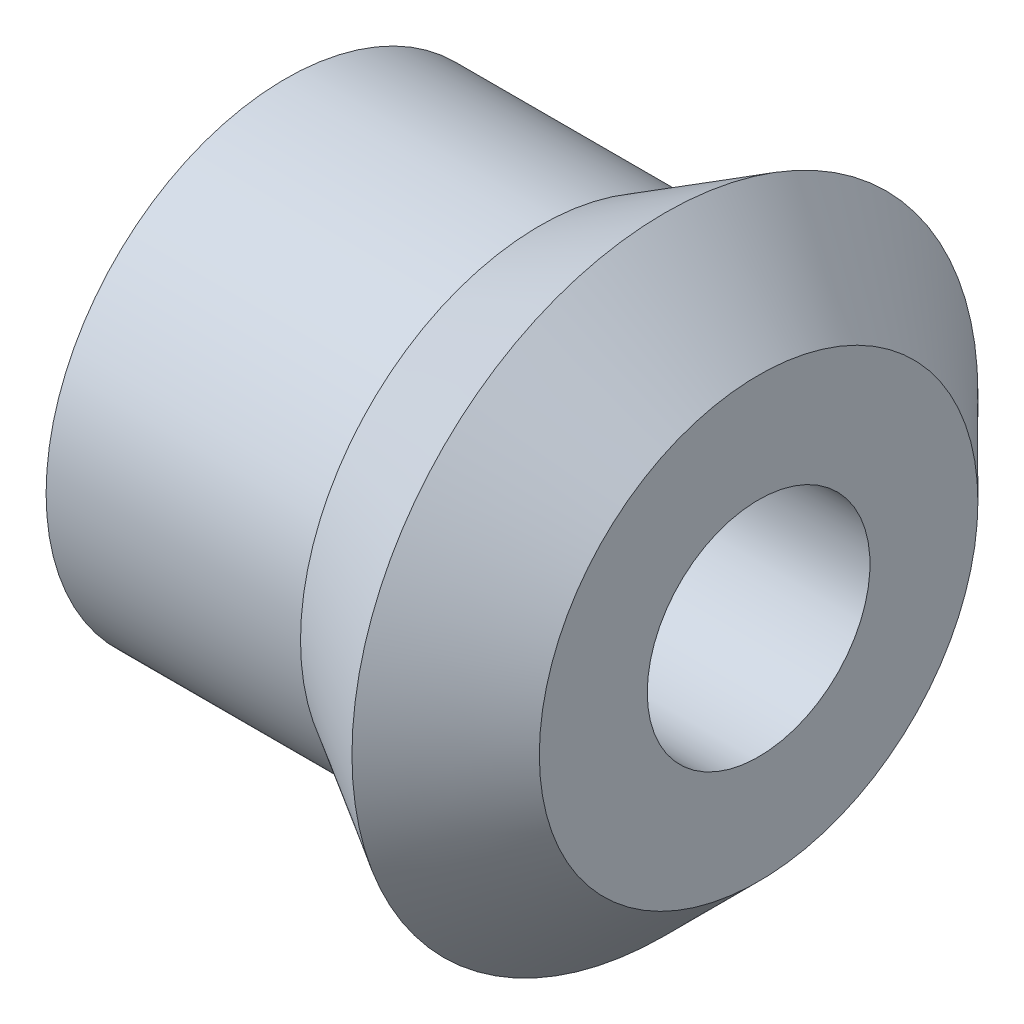
ISO-10303-21;
HEADER;
FILE_DESCRIPTION(('STEP AP214'),'2;1');
FILE_NAME('part.step','',(''),(''),'','','');
FILE_SCHEMA(('AUTOMOTIVE_DESIGN { 1 0 10303 214 1 1 1 1 }'));
ENDSEC;
DATA;
#1=APPLICATION_CONTEXT('core data for automotive mechanical design processes');
#2=APPLICATION_PROTOCOL_DEFINITION('international standard','automotive_design',2000,#1);
#3=PRODUCT_CONTEXT('',#1,'mechanical');
#4=PRODUCT('Part','Part','',(#3));
#5=PRODUCT_RELATED_PRODUCT_CATEGORY('part','',(#4));
#6=PRODUCT_DEFINITION_FORMATION('','',#4);
#7=PRODUCT_DEFINITION_CONTEXT('part definition',#1,'design');
#8=PRODUCT_DEFINITION('design','',#6,#7);
#9=PRODUCT_DEFINITION_SHAPE('','',#8);
#10=(LENGTH_UNIT() NAMED_UNIT(*) SI_UNIT(.MILLI.,.METRE.));
#11=(NAMED_UNIT(*) PLANE_ANGLE_UNIT() SI_UNIT($,.RADIAN.));
#12=(NAMED_UNIT(*) SI_UNIT($,.STERADIAN.) SOLID_ANGLE_UNIT());
#13=UNCERTAINTY_MEASURE_WITH_UNIT(LENGTH_MEASURE(1.E-05),#10,'distance_accuracy_value','');
#14=(GEOMETRIC_REPRESENTATION_CONTEXT(3) GLOBAL_UNCERTAINTY_ASSIGNED_CONTEXT((#13)) GLOBAL_UNIT_ASSIGNED_CONTEXT((#10,
#11,#12)) REPRESENTATION_CONTEXT('',''));
#15=CARTESIAN_POINT('',(0.,0.,0.));
#16=DIRECTION('',(0.,0.,1.));
#17=DIRECTION('',(1.,0.,0.));
#18=AXIS2_PLACEMENT_3D('',#15,#16,#17);
#19=CARTESIAN_POINT('',(1.58826150610927,2.425,0.));
#20=DIRECTION('',(-1.,0.,0.));
#21=DIRECTION('',(0.,0.,1.));
#22=AXIS2_PLACEMENT_3D('',#19,#20,#21);
#23=PLANE('',#22);
#24=CARTESIAN_POINT('',(1.58826150610925,0.,0.));
#25=DIRECTION('',(-1.,0.,0.));
#26=DIRECTION('',(0.,0.,1.));
#27=AXIS2_PLACEMENT_3D('',#24,#25,#26);
#28=CIRCLE('',#27,4.775);
#29=CARTESIAN_POINT('',(1.58826150610925,0.,4.775));
#30=VERTEX_POINT('',#29);
#31=EDGE_CURVE('E53',#30,#30,#28,.T.);
#32=ORIENTED_EDGE('',*,*,#31,.F.);
#33=EDGE_LOOP('',(#32));
#34=FACE_BOUND('',#33,.T.);
#35=CARTESIAN_POINT('',(1.58826150610928,0.,0.));
#36=DIRECTION('',(-1.,0.,0.));
#37=DIRECTION('',(0.,0.,1.));
#38=AXIS2_PLACEMENT_3D('',#35,#36,#37);
#39=CIRCLE('',#38,2.425);
#40=CARTESIAN_POINT('',(1.58826150610928,0.,2.425));
#41=VERTEX_POINT('',#40);
#42=EDGE_CURVE('E10',#41,#41,#39,.T.);
#43=ORIENTED_EDGE('',*,*,#42,.T.);
#44=EDGE_LOOP('',(#43));
#45=FACE_BOUND('',#44,.T.);
#46=ADVANCED_FACE('F31',(#34,#45),#23,.F.);
#47=CARTESIAN_POINT('',(-22.2616484326181,0.,0.));
#48=DIRECTION('',(-1.,0.,0.));
#49=DIRECTION('',(0.,0.,1.));
#50=AXIS2_PLACEMENT_3D('',#47,#48,#49);
#51=CYLINDRICAL_SURFACE('',#50,2.425);
#52=ORIENTED_EDGE('',*,*,#42,.F.);
#53=EDGE_LOOP('',(#52));
#54=FACE_BOUND('',#53,.T.);
#55=CARTESIAN_POINT('',(-8.71173849389072,0.,0.));
#56=DIRECTION('',(-1.,0.,0.));
#57=DIRECTION('',(0.,0.,1.));
#58=AXIS2_PLACEMENT_3D('',#55,#56,#57);
#59=CIRCLE('',#58,2.425);
#60=CARTESIAN_POINT('',(-8.71173849389072,0.,2.425));
#61=VERTEX_POINT('',#60);
#62=EDGE_CURVE('E37',#61,#61,#59,.T.);
#63=ORIENTED_EDGE('',*,*,#62,.T.);
#64=EDGE_LOOP('',(#63));
#65=FACE_BOUND('',#64,.T.);
#66=ADVANCED_FACE('F60',(#54,#65),#51,.F.);
#67=CARTESIAN_POINT('',(-8.71173849389072,2.425,0.));
#68=DIRECTION('',(1.,0.,0.));
#69=DIRECTION('',(0.,0.,-1.));
#70=AXIS2_PLACEMENT_3D('',#67,#68,#69);
#71=PLANE('',#70);
#72=ORIENTED_EDGE('',*,*,#62,.F.);
#73=EDGE_LOOP('',(#72));
#74=FACE_BOUND('',#73,.T.);
#75=CARTESIAN_POINT('',(-8.71173849389072,0.,0.));
#76=DIRECTION('',(-1.,0.,0.));
#77=DIRECTION('',(0.,0.,1.));
#78=AXIS2_PLACEMENT_3D('',#75,#76,#77);
#79=CIRCLE('',#78,5.215);
#80=CARTESIAN_POINT('',(-8.71173849389072,0.,5.215));
#81=VERTEX_POINT('',#80);
#82=EDGE_CURVE('E41',#81,#81,#79,.T.);
#83=ORIENTED_EDGE('',*,*,#82,.T.);
#84=EDGE_LOOP('',(#83));
#85=FACE_BOUND('',#84,.T.);
#86=ADVANCED_FACE('F64',(#74,#85),#71,.F.);
#87=CARTESIAN_POINT('',(-22.2616484326181,0.,0.));
#88=DIRECTION('',(-1.,0.,0.));
#89=DIRECTION('',(0.,0.,1.));
#90=AXIS2_PLACEMENT_3D('',#87,#88,#89);
#91=CYLINDRICAL_SURFACE('',#90,5.215);
#92=ORIENTED_EDGE('',*,*,#82,.F.);
#93=EDGE_LOOP('',(#92));
#94=FACE_BOUND('',#93,.T.);
#95=CARTESIAN_POINT('',(-3.17173849389075,0.,0.));
#96=DIRECTION('',(-1.,0.,0.));
#97=DIRECTION('',(0.,0.,1.));
#98=AXIS2_PLACEMENT_3D('',#95,#96,#97);
#99=CIRCLE('',#98,5.215);
#100=CARTESIAN_POINT('',(-3.17173849389075,0.,5.215));
#101=VERTEX_POINT('',#100);
#102=EDGE_CURVE('E45',#101,#101,#99,.T.);
#103=ORIENTED_EDGE('',*,*,#102,.T.);
#104=EDGE_LOOP('',(#103));
#105=FACE_BOUND('',#104,.T.);
#106=ADVANCED_FACE('F69',(#94,#105),#91,.T.);
#107=CARTESIAN_POINT('',(-0.451738493890758,0.,0.));
#108=DIRECTION('',(1.,0.,0.));
#109=DIRECTION('',(0.,0.,-1.));
#110=AXIS2_PLACEMENT_3D('',#107,#108,#109);
#111=CONICAL_SURFACE('',#110,6.815,0.531724067258807);
#112=ORIENTED_EDGE('',*,*,#102,.F.);
#113=EDGE_LOOP('',(#112));
#114=FACE_BOUND('',#113,.T.);
#115=CARTESIAN_POINT('',(-0.451738493890758,0.,0.));
#116=DIRECTION('',(-1.,0.,0.));
#117=DIRECTION('',(0.,0.,1.));
#118=AXIS2_PLACEMENT_3D('',#115,#116,#117);
#119=CIRCLE('',#118,6.815);
#120=CARTESIAN_POINT('',(-0.451738493890758,0.,6.815));
#121=VERTEX_POINT('',#120);
#122=EDGE_CURVE('E50',#121,#121,#119,.T.);
#123=ORIENTED_EDGE('',*,*,#122,.T.);
#124=EDGE_LOOP('',(#123));
#125=FACE_BOUND('',#124,.T.);
#126=ADVANCED_FACE('F75',(#114,#125),#111,.T.);
#127=CARTESIAN_POINT('',(1.58826150610925,0.,0.));
#128=DIRECTION('',(-1.,0.,0.));
#129=DIRECTION('',(0.,0.,1.));
#130=AXIS2_PLACEMENT_3D('',#127,#128,#129);
#131=CONICAL_SURFACE('',#130,4.775,0.785398163397446);
#132=ORIENTED_EDGE('',*,*,#122,.F.);
#133=EDGE_LOOP('',(#132));
#134=FACE_BOUND('',#133,.T.);
#135=ORIENTED_EDGE('',*,*,#31,.T.);
#136=EDGE_LOOP('',(#135));
#137=FACE_BOUND('',#136,.T.);
#138=ADVANCED_FACE('F57',(#134,#137),#131,.T.);
#139=CLOSED_SHELL('',(#46,#66,#86,#106,#126,#138));
#140=MANIFOLD_SOLID_BREP('B2',#139);
#141=ADVANCED_BREP_SHAPE_REPRESENTATION('',(#18,#140),#14);
#142=SHAPE_DEFINITION_REPRESENTATION(#9,#141);
ENDSEC;
END-ISO-10303-21;
